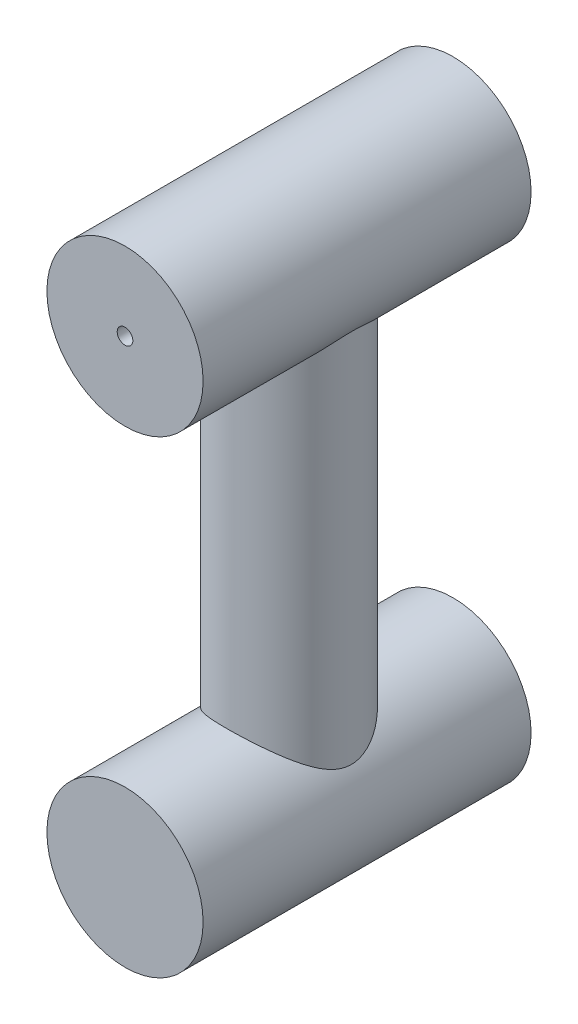
ISO-10303-21;
HEADER;
FILE_DESCRIPTION(('STEP AP214'),'2;1');
FILE_NAME('part.step','',(''),(''),'','','');
FILE_SCHEMA(('AUTOMOTIVE_DESIGN { 1 0 10303 214 1 1 1 1 }'));
ENDSEC;
DATA;
#1=APPLICATION_CONTEXT('core data for automotive mechanical design processes');
#2=APPLICATION_PROTOCOL_DEFINITION('international standard','automotive_design',2000,#1);
#3=PRODUCT_CONTEXT('',#1,'mechanical');
#4=PRODUCT('Part','Part','',(#3));
#5=PRODUCT_RELATED_PRODUCT_CATEGORY('part','',(#4));
#6=PRODUCT_DEFINITION_FORMATION('','',#4);
#7=PRODUCT_DEFINITION_CONTEXT('part definition',#1,'design');
#8=PRODUCT_DEFINITION('design','',#6,#7);
#9=PRODUCT_DEFINITION_SHAPE('','',#8);
#10=(LENGTH_UNIT() NAMED_UNIT(*) SI_UNIT(.MILLI.,.METRE.));
#11=(NAMED_UNIT(*) PLANE_ANGLE_UNIT() SI_UNIT($,.RADIAN.));
#12=(NAMED_UNIT(*) SI_UNIT($,.STERADIAN.) SOLID_ANGLE_UNIT());
#13=UNCERTAINTY_MEASURE_WITH_UNIT(LENGTH_MEASURE(1.E-05),#10,'distance_accuracy_value','');
#14=(GEOMETRIC_REPRESENTATION_CONTEXT(3) GLOBAL_UNCERTAINTY_ASSIGNED_CONTEXT((#13)) GLOBAL_UNIT_ASSIGNED_CONTEXT((#10,
#11,#12)) REPRESENTATION_CONTEXT('',''));
#15=CARTESIAN_POINT('',(0.,0.,0.));
#16=DIRECTION('',(0.,0.,1.));
#17=DIRECTION('',(1.,0.,0.));
#18=AXIS2_PLACEMENT_3D('',#15,#16,#17);
#19=CARTESIAN_POINT('',(0.,150.,0.));
#20=DIRECTION('',(0.,-1.,0.));
#21=DIRECTION('',(0.,0.,-1.));
#22=AXIS2_PLACEMENT_3D('',#19,#20,#21);
#23=CYLINDRICAL_SURFACE('',#22,20.);
#24=CARTESIAN_POINT('',(0.,25.,-20.));
#25=CARTESIAN_POINT('',(0.480230989703531,24.9999961848675,-19.9999960873677));
#26=CARTESIAN_POINT('',(0.960535836305338,24.9861312304145,-19.9826723587445));
#27=CARTESIAN_POINT('',(1.91728683457106,24.9309814349292,-19.9136700404392));
#28=CARTESIAN_POINT('',(2.3937308090506,24.8896820830818,-19.8619732698869));
#29=CARTESIAN_POINT('',(3.33960791078649,24.7805185198449,-19.7250047398072));
#30=CARTESIAN_POINT('',(3.80902584649178,24.712603532766,-19.6396688036891));
#31=CARTESIAN_POINT('',(4.73639266175432,24.5517428296068,-19.4368692020349));
#32=CARTESIAN_POINT('',(5.19434281461134,24.4587999060374,-19.3194091207517));
#33=CARTESIAN_POINT('',(6.09302297940696,24.2504947079046,-19.0550013907087));
#34=CARTESIAN_POINT('',(6.53384455581926,24.135279959547,-18.9082475825725));
#35=CARTESIAN_POINT('',(7.39905284145709,23.8842407598241,-18.5867436845025));
#36=CARTESIAN_POINT('',(7.82343944789078,23.7484161795817,-18.4119934195011));
#37=CARTESIAN_POINT('',(8.65393451268829,23.4585340233295,-18.0365476676675));
#38=CARTESIAN_POINT('',(9.06004750544,23.3044810053207,-17.8358586656344));
#39=CARTESIAN_POINT('',(9.85291114261492,22.9805057097293,-17.4104176654588));
#40=CARTESIAN_POINT('',(10.239657802922,22.8105801872293,-17.185660745577));
#41=CARTESIAN_POINT('',(11.1240837702697,22.3957408802365,-16.631708753019));
#42=CARTESIAN_POINT('',(11.6134997974831,22.1453183968945,-16.2933984442422));
#43=CARTESIAN_POINT('',(12.5542891253821,21.6258819372534,-15.5800698126026));
#44=CARTESIAN_POINT('',(13.005650188539,21.3568620307175,-15.2050397647464));
#45=CARTESIAN_POINT('',(13.8707836996136,20.8054114271942,-14.4202417370912));
#46=CARTESIAN_POINT('',(14.2844532162996,20.5229470353298,-14.0103842111519));
#47=CARTESIAN_POINT('',(15.0724701469454,19.9513787857267,-13.1589192513533));
#48=CARTESIAN_POINT('',(15.4468220253881,19.6622756863602,-12.7173154318702));
#49=CARTESIAN_POINT('',(16.1614492543608,19.0793974271459,-11.7962985532676));
#50=CARTESIAN_POINT('',(16.5010997452855,18.7856199454358,-11.3164020038731));
#51=CARTESIAN_POINT('',(17.1388512744731,18.2056451793498,-10.3250788941917));
#52=CARTESIAN_POINT('',(17.4369391773761,17.9194503144112,-9.81364243941471));
#53=CARTESIAN_POINT('',(17.9891202491486,17.3650266544061,-8.76038016086283));
#54=CARTESIAN_POINT('',(18.2433325567539,17.0967504593018,-8.21864209510451));
#55=CARTESIAN_POINT('',(18.705911709388,16.5893497664292,-7.10302063922598));
#56=CARTESIAN_POINT('',(18.9143177227039,16.350200441349,-6.52916524318589));
#57=CARTESIAN_POINT('',(19.2031751366055,16.0082771872612,-5.60037075410327));
#58=CARTESIAN_POINT('',(19.3003699483551,15.8907318506006,-5.25601185870824));
#59=CARTESIAN_POINT('',(19.4771961806058,15.6734941834036,-4.55726308551195));
#60=CARTESIAN_POINT('',(19.5568303868741,15.573799021636,-4.20287480882394));
#61=CARTESIAN_POINT('',(19.6972552533926,15.3958112505024,-3.48586769498367));
#62=CARTESIAN_POINT('',(19.7580855656028,15.3174736460166,-3.12326793175904));
#63=CARTESIAN_POINT('',(19.8600201720531,15.1850786698748,-2.3908682437235));
#64=CARTESIAN_POINT('',(19.901124706637,15.1310210023862,-2.02106840669726));
#65=CARTESIAN_POINT('',(19.962971581675,15.0493339995019,-1.27344787413833));
#66=CARTESIAN_POINT('',(19.9835283203066,15.021945615624,-0.895585009326308));
#67=CARTESIAN_POINT('',(20.0031075411687,14.9958649721026,-0.13831657356457));
#68=CARTESIAN_POINT('',(20.002131085978,14.9971712964875,0.241088920338706));
#69=CARTESIAN_POINT('',(19.9786629633872,15.0284195746855,0.998309025602272));
#70=CARTESIAN_POINT('',(19.9561556870445,15.0583823031863,1.37612228306018));
#71=CARTESIAN_POINT('',(19.8901730043733,15.1454268921656,2.12674651807091));
#72=CARTESIAN_POINT('',(19.8466946666454,15.2025125439529,2.49955678880044));
#73=CARTESIAN_POINT('',(19.7313572667812,15.3519959503499,3.29537216756557));
#74=CARTESIAN_POINT('',(19.656123170792,15.4485199241233,3.71710930279068));
#75=CARTESIAN_POINT('',(19.4806804186697,15.6691696556899,4.54791367768941));
#76=CARTESIAN_POINT('',(19.3804663721062,15.7933013703414,4.95697816127987));
#77=CARTESIAN_POINT('',(19.156558761323,16.0641576278707,5.762056080849));
#78=CARTESIAN_POINT('',(19.0328077958795,16.210937235134,6.15803477313653));
#79=CARTESIAN_POINT('',(18.7635141789238,16.5218910140841,6.93540042100296));
#80=CARTESIAN_POINT('',(18.6179697853777,16.6860665759907,7.31678620705125));
#81=CARTESIAN_POINT('',(18.2297427509491,17.1112524260242,8.24874571504505));
#82=CARTESIAN_POINT('',(17.9744505911235,17.3802326509791,8.79045763071513));
#83=CARTESIAN_POINT('',(17.420755984275,17.9351938891373,9.84229180696013));
#84=CARTESIAN_POINT('',(17.122333612766,18.2211827235266,10.3523993110648));
#85=CARTESIAN_POINT('',(16.4835639709425,18.8010220720833,11.3419236297298));
#86=CARTESIAN_POINT('',(16.1431681112148,19.0948813834683,11.8213038798201));
#87=CARTESIAN_POINT('',(15.4215686510459,19.6822690166449,12.7483398529192));
#88=CARTESIAN_POINT('',(15.0403717610555,19.9757973848658,13.1960007726658));
#89=CARTESIAN_POINT('',(14.2267204789852,20.56353520931,14.0700505822943));
#90=CARTESIAN_POINT('',(13.7931665008075,20.8575522530836,14.4955483296281));
#91=CARTESIAN_POINT('',(12.88370321592,21.4312715917016,15.3095623417148));
#92=CARTESIAN_POINT('',(12.4077876821241,21.7109717724385,15.6980731520131));
#93=CARTESIAN_POINT('',(11.4153689615401,22.2487508185826,16.4337990435267));
#94=CARTESIAN_POINT('',(10.8989612105796,22.5068777273405,16.7811066493549));
#95=CARTESIAN_POINT('',(10.0947877798958,22.8731742166952,17.2682798593382));
#96=CARTESIAN_POINT('',(9.82183889485741,22.9917772413649,17.425022116157));
#97=CARTESIAN_POINT('',(9.26623527822425,23.2212666354261,17.7267264088392));
#98=CARTESIAN_POINT('',(8.98357823130772,23.332151144657,17.87168560639));
#99=CARTESIAN_POINT('',(8.28706523180419,23.5905697847685,18.2079924512593));
#100=CARTESIAN_POINT('',(7.86843138186448,23.7336902183121,18.3929235893383));
#101=CARTESIAN_POINT('',(7.01408763071896,24.0000570456058,18.7353759658125));
#102=CARTESIAN_POINT('',(6.57838200132552,24.1233083721521,18.8929040081973));
#103=CARTESIAN_POINT('',(5.69208561485838,24.3476687648972,19.1785501880921));
#104=CARTESIAN_POINT('',(5.24150238234391,24.4487888327059,19.3066829397495));
#105=CARTESIAN_POINT('',(4.32790269268517,24.6269331335526,19.53178364313));
#106=CARTESIAN_POINT('',(3.86488591273866,24.7039567403355,19.6287507848761));
#107=CARTESIAN_POINT('',(2.92716764551453,24.8325753779163,19.7903818084788));
#108=CARTESIAN_POINT('',(2.45241735536775,24.8840339375832,19.8548723484217));
#109=CARTESIAN_POINT('',(1.49734229662201,24.9597159082281,19.9496424544463));
#110=CARTESIAN_POINT('',(1.01701753733561,24.9839393646978,19.9799220776715));
#111=CARTESIAN_POINT('',(0.0549043345204943,25.0045691499641,20.0057126367381));
#112=CARTESIAN_POINT('',(-0.426883892252319,25.0009794148755,20.0012284923378));
#113=CARTESIAN_POINT('',(-1.38785496908958,24.9660769609783,19.9575843387199));
#114=CARTESIAN_POINT('',(-1.8670379511332,24.934765659935,19.9184261028409));
#115=CARTESIAN_POINT('',(-2.78015849643189,24.8488165268105,19.810720193198));
#116=CARTESIAN_POINT('',(-3.21461112564091,24.7962787328625,19.7448164682203));
#117=CARTESIAN_POINT('',(-4.07513436349093,24.6694630558277,19.5853196961158));
#118=CARTESIAN_POINT('',(-4.50120551269393,24.5951865797115,19.4917284409766));
#119=CARTESIAN_POINT('',(-5.34259277816532,24.42623358784,19.2781004887208));
#120=CARTESIAN_POINT('',(-5.75790677120596,24.3315530786317,19.1580586146173));
#121=CARTESIAN_POINT('',(-6.57564496026684,24.12341056485,18.8930057816754));
#122=CARTESIAN_POINT('',(-6.97806844142222,24.0099475208046,18.7479934408916));
#123=CARTESIAN_POINT('',(-7.79276711501759,23.7584841992485,18.4248878921773));
#124=CARTESIAN_POINT('',(-8.20411611290138,23.6194013702753,18.2453048544663));
#125=CARTESIAN_POINT('',(-9.00889225247002,23.3243132570969,17.8616521346834));
#126=CARTESIAN_POINT('',(-9.40231886281722,23.1683074716468,17.6575817272956));
#127=CARTESIAN_POINT('',(-10.1701153552395,22.8416894726975,17.2267961362735));
#128=CARTESIAN_POINT('',(-10.5444883893908,22.6710796877776,17.0000847166964));
#129=CARTESIAN_POINT('',(-11.2735701785671,22.3175002002136,16.5256117016954));
#130=CARTESIAN_POINT('',(-11.6282759811351,22.1345286509113,16.2778469597967));
#131=CARTESIAN_POINT('',(-12.3827270021154,21.7229363307972,15.7140013916475));
#132=CARTESIAN_POINT('',(-12.7783040292519,21.4922264773285,15.3938621330051));
#133=CARTESIAN_POINT('',(-13.5405215254044,21.0203530896377,14.7278812003496));
#134=CARTESIAN_POINT('',(-13.9071586804601,20.7791883630926,14.3820365915465));
#135=CARTESIAN_POINT('',(-14.6122013533565,20.2896088485507,13.6651754843115));
#136=CARTESIAN_POINT('',(-14.9505268508652,20.0411760229962,13.2940926782727));
#137=CARTESIAN_POINT('',(-15.5976192298561,19.5417845920472,12.5285867148805));
#138=CARTESIAN_POINT('',(-15.9063841626685,19.2908258213427,12.1341620215698));
#139=CARTESIAN_POINT('',(-16.5567761209823,18.7374522199289,11.2357912606664));
#140=CARTESIAN_POINT('',(-16.8913536392883,18.4354859261251,10.7264360072061));
#141=CARTESIAN_POINT('',(-17.5155207405159,17.8435299837978,9.67373545045226));
#142=CARTESIAN_POINT('',(-17.8050864582713,17.5535467480784,9.13037232893952));
#143=CARTESIAN_POINT('',(-18.3358678585784,16.9983189540831,8.01113941161474));
#144=CARTESIAN_POINT('',(-18.5772503518305,16.7329908075117,7.43539093373043));
#145=CARTESIAN_POINT('',(-19.008964021819,16.2408850502207,6.24950918151507));
#146=CARTESIAN_POINT('',(-19.1993581696422,16.0140600158116,5.6394194570051));
#147=CARTESIAN_POINT('',(-19.4487995760101,15.7087030989653,4.67605613825766));
#148=CARTESIAN_POINT('',(-19.5279053451975,15.6100539569417,4.33425194951327));
#149=CARTESIAN_POINT('',(-19.6687547088484,15.4322049914862,3.64207807353175));
#150=CARTESIAN_POINT('',(-19.7305013213618,15.353001787502,3.29170988675247));
#151=CARTESIAN_POINT('',(-19.8354952496202,15.2171129521132,2.58467642413906));
#152=CARTESIAN_POINT('',(-19.8787832343268,15.1603778377851,2.22802681360336));
#153=CARTESIAN_POINT('',(-19.9461891908989,15.0715849069154,1.50982970202826));
#154=CARTESIAN_POINT('',(-19.970307290811,15.0395269255412,1.14828223372085));
#155=CARTESIAN_POINT('',(-19.9988963097935,15.0014910958757,0.421038396001951));
#156=CARTESIAN_POINT('',(-20.00325928095,14.9956565414837,0.0553301523515066));
#157=CARTESIAN_POINT('',(-19.9919373640192,15.010746863965,-0.675205405837988));
#158=CARTESIAN_POINT('',(-19.9762528240442,15.0316712761858,-1.04003273556334));
#159=CARTESIAN_POINT('',(-19.9251769640672,15.099307811783,-1.76637086354416));
#160=CARTESIAN_POINT('',(-19.8897586316735,15.1460552820251,-2.12787642384807));
#161=CARTESIAN_POINT('',(-19.7999666765461,15.2632476527416,-2.84461842112777));
#162=CARTESIAN_POINT('',(-19.745590124879,15.3336962148363,-3.19985388049516));
#163=CARTESIAN_POINT('',(-19.6014887547507,15.517692296957,-3.99854431614062));
#164=CARTESIAN_POINT('',(-19.5061601205305,15.6377605537574,-4.43948708980482));
#165=CARTESIAN_POINT('',(-19.2884919453343,15.9054632992559,-5.30602322130213));
#166=CARTESIAN_POINT('',(-19.1661435082343,16.0531068644995,-5.73161146992649));
#167=CARTESIAN_POINT('',(-18.8960714711118,16.3701531649741,-6.56748573501336));
#168=CARTESIAN_POINT('',(-18.7482873684788,16.539607532446,-6.97773235986948));
#169=CARTESIAN_POINT('',(-18.4291192260517,16.8945133462898,-7.78168629093866));
#170=CARTESIAN_POINT('',(-18.2577342560041,17.079965423121,-8.17539294441221));
#171=CARTESIAN_POINT('',(-17.8095827766314,17.5489655484806,-9.12160860423861));
#172=CARTESIAN_POINT('',(-17.5202929830492,17.8388318746095,-9.66508540470204));
#173=CARTESIAN_POINT('',(-16.8964436603964,18.4308281603071,-10.7184432121036));
#174=CARTESIAN_POINT('',(-16.5618657183709,18.732963072798,-11.2283104282466));
#175=CARTESIAN_POINT('',(-15.8482879271303,19.3404126764517,-12.2148536253121));
#176=CARTESIAN_POINT('',(-15.4692461046248,19.6457301201562,-12.6914975563328));
#177=CARTESIAN_POINT('',(-14.6676100989712,20.2512609716486,-13.6100213768864));
#178=CARTESIAN_POINT('',(-14.2450228000759,20.5514751775089,-14.0519067421009));
#179=CARTESIAN_POINT('',(-13.3507061056025,21.1435580554426,-14.9045400439836));
#180=CARTESIAN_POINT('',(-12.8784006852095,21.4352638367223,-15.3147988667469));
#181=CARTESIAN_POINT('',(-11.8898743997865,21.9989686225749,-16.0943168368688));
#182=CARTESIAN_POINT('',(-11.3736462703045,22.2709643534401,-16.4635691787238));
#183=CARTESIAN_POINT('',(-10.2999855725546,22.7873721078698,-17.1556765770374));
#184=CARTESIAN_POINT('',(-9.74265566265225,23.0318492432367,-17.478641671167));
#185=CARTESIAN_POINT('',(-8.58844668771732,23.4866490913199,-18.0737237537101));
#186=CARTESIAN_POINT('',(-7.99159213315966,23.6969926971429,-18.3458718626501));
#187=CARTESIAN_POINT('',(-6.96365142630765,24.0144793347202,-18.7538200416705));
#188=CARTESIAN_POINT('',(-6.54211563765548,24.1328869718868,-18.9051173274364));
#189=CARTESIAN_POINT('',(-5.68497622087226,24.3490501254052,-19.1802896508597));
#190=CARTESIAN_POINT('',(-5.24937364512001,24.4468071825816,-19.3041667344841));
#191=CARTESIAN_POINT('',(-4.36753016505049,24.6196290238545,-19.5225658352498));
#192=CARTESIAN_POINT('',(-3.92131554569164,24.6947446239837,-19.6171536019856));
#193=CARTESIAN_POINT('',(-3.02031822549153,24.8210480155094,-19.7759133096869));
#194=CARTESIAN_POINT('',(-2.5655394326392,24.8722464580861,-19.8400987900744));
#195=CARTESIAN_POINT('',(-1.75888736046638,24.9405137175445,-19.9256042118999));
#196=CARTESIAN_POINT('',(-1.40812900270433,24.9627918945395,-19.9534735152448));
#197=CARTESIAN_POINT('',(-0.704927264758647,24.9925380835892,-19.9906749075479));
#198=CARTESIAN_POINT('',(-0.352483527123381,25.0000028002595,-20.000002871823));
#199=CARTESIAN_POINT('',(0.,25.,-20.));
#200=B_SPLINE_CURVE_WITH_KNOTS('',3,(#24,#25,#26,#27,#28,#29,#30,#31,#32,#33,#34,#35,#36,#37,
#38,#39,#40,#41,#42,#43,#44,#45,#46,#47,#48,#49,#50,#51,#52,#53,#54,#55,#56,#57,#58,#59,#60,#61,
#62,#63,#64,#65,#66,#67,#68,#69,#70,#71,#72,#73,#74,#75,#76,#77,#78,#79,#80,#81,#82,#83,#84,#85,
#86,#87,#88,#89,#90,#91,#92,#93,#94,#95,#96,#97,#98,#99,#100,#101,#102,#103,#104,#105,#106,#107,
#108,#109,#110,#111,#112,#113,#114,#115,#116,#117,#118,#119,#120,#121,#122,#123,#124,#125,#126,
#127,#128,#129,#130,#131,#132,#133,#134,#135,#136,#137,#138,#139,#140,#141,#142,#143,#144,#145,
#146,#147,#148,#149,#150,#151,#152,#153,#154,#155,#156,#157,#158,#159,#160,#161,#162,#163,#164,
#165,#166,#167,#168,#169,#170,#171,#172,#173,#174,#175,#176,#177,#178,#179,#180,#181,#182,#183,
#184,#185,#186,#187,#188,#189,#190,#191,#192,#193,#194,#195,#196,#197,#198,#199),.UNSPECIFIED.,
.T.,.F.,(4,2,2,2,2,2,2,2,2,2,2,2,2,2,2,2,2,2,2,2,2,2,2,2,2,2,2,2,2,2,2,2,2,2,2,2,2,2,2,2,2,2,2,
2,2,2,2,2,2,2,2,2,2,2,2,2,2,2,2,2,2,2,2,2,2,2,2,2,2,2,2,2,2,2,2,2,2,2,2,2,2,2,2,2,2,2,2,4),(0.,
1.4403137930791,2.88139001537349,4.32522892398689,5.76890680188147,7.20333074629157,
8.63776366079905,10.0718386518902,11.5062074644402,13.4400199592029,15.3744519666943,
17.3140175594305,19.2533626775734,21.223053242228,23.1933648999037,25.1582392425343,
27.1214268566114,28.250500792503,29.3793954860789,30.5058931681581,31.6323771243511,
32.7689467217837,33.9054602340844,35.0427982959194,36.1802953844596,37.4956824296446,
38.8113535686643,40.130275457837,41.4493028299286,43.4158969357586,45.3834024530428,
47.3532073647767,49.3226888036402,51.3449316402351,53.3674722360229,55.3853814808751,
56.3940844689467,57.4030297185555,58.8400974705322,60.2768078981553,61.712802496146,
63.1488344118286,64.5924519116314,66.0360670001163,67.4794777923416,68.9228147684062,
70.24897947206,71.5750583626742,72.9013970279613,74.2278091206769,75.6361295515189,
77.0444917071215,78.4526201117595,79.8609593363193,81.5356358539052,83.2105038645389,
84.8899561993964,86.5695191697533,88.60752224703,90.646602210751,92.6784955245126,
94.7078677358487,95.800341801628,96.8926258130675,97.9824906574178,99.0723482218806,
100.168153962273,101.263940674954,102.361231041829,103.458691008786,104.857006416013,
106.255782899233,107.657933768014,109.060139919912,111.098801075017,113.138293599126,
115.179727108252,117.220838373904,119.288945022562,121.357394386303,123.420841870812,
125.483021517334,126.871460501995,128.259795852899,129.644991644136,131.029569967839,
132.08650714014,133.143679411056),.UNSPECIFIED.);
#201=CARTESIAN_POINT('',(0.,25.,-20.));
#202=VERTEX_POINT('',#201);
#203=EDGE_CURVE('E64',#202,#202,#200,.T.);
#204=ORIENTED_EDGE('',*,*,#203,.F.);
#205=EDGE_LOOP('',(#204));
#206=FACE_BOUND('',#205,.T.);
#207=CARTESIAN_POINT('',(0.,125.,-20.));
#208=CARTESIAN_POINT('',(-0.480230989703532,125.000003815133,-19.9999960873677));
#209=CARTESIAN_POINT('',(-0.960535836305339,125.013868769585,-19.9826723587445));
#210=CARTESIAN_POINT('',(-1.91728683457106,125.069018565071,-19.9136700404392));
#211=CARTESIAN_POINT('',(-2.39373080905061,125.110317916918,-19.8619732698869));
#212=CARTESIAN_POINT('',(-3.33960791078649,125.219481480155,-19.7250047398072));
#213=CARTESIAN_POINT('',(-3.80902584649178,125.287396467234,-19.6396688036891));
#214=CARTESIAN_POINT('',(-4.73639266175432,125.448257170393,-19.4368692020349));
#215=CARTESIAN_POINT('',(-5.19434281461134,125.541200093963,-19.3194091207517));
#216=CARTESIAN_POINT('',(-6.09302297940696,125.749505292095,-19.0550013907087));
#217=CARTESIAN_POINT('',(-6.53384455581925,125.864720040453,-18.9082475825725));
#218=CARTESIAN_POINT('',(-7.39905284145708,126.115759240176,-18.5867436845025));
#219=CARTESIAN_POINT('',(-7.82343944789077,126.251583820418,-18.4119934195011));
#220=CARTESIAN_POINT('',(-8.65393451268828,126.54146597667,-18.0365476676675));
#221=CARTESIAN_POINT('',(-9.06004750543999,126.695518994679,-17.8358586656344));
#222=CARTESIAN_POINT('',(-9.85291114261492,127.019494290271,-17.4104176654588));
#223=CARTESIAN_POINT('',(-10.239657802922,127.189419812771,-17.185660745577));
#224=CARTESIAN_POINT('',(-11.1240837702697,127.604259119764,-16.631708753019));
#225=CARTESIAN_POINT('',(-11.6134997974831,127.854681603106,-16.2933984442422));
#226=CARTESIAN_POINT('',(-12.5542891253821,128.374118062747,-15.5800698126026));
#227=CARTESIAN_POINT('',(-13.005650188539,128.643137969283,-15.2050397647464));
#228=CARTESIAN_POINT('',(-13.8707836996136,129.194588572806,-14.4202417370912));
#229=CARTESIAN_POINT('',(-14.2844532162996,129.47705296467,-14.0103842111519));
#230=CARTESIAN_POINT('',(-15.0724701469454,130.048621214273,-13.1589192513533));
#231=CARTESIAN_POINT('',(-15.4468220253881,130.33772431364,-12.7173154318702));
#232=CARTESIAN_POINT('',(-16.1614492543608,130.920602572854,-11.7962985532676));
#233=CARTESIAN_POINT('',(-16.5010997452855,131.214380054564,-11.3164020038731));
#234=CARTESIAN_POINT('',(-17.138851274473,131.79435482065,-10.3250788941917));
#235=CARTESIAN_POINT('',(-17.4369391773761,132.080549685589,-9.81364243941472));
#236=CARTESIAN_POINT('',(-17.9891202491486,132.634973345594,-8.76038016086284));
#237=CARTESIAN_POINT('',(-18.2433325567539,132.903249540698,-8.21864209510451));
#238=CARTESIAN_POINT('',(-18.705911709388,133.410650233571,-7.10302063922598));
#239=CARTESIAN_POINT('',(-18.9143177227039,133.649799558651,-6.5291652431859));
#240=CARTESIAN_POINT('',(-19.2031751366055,133.991722812739,-5.60037075410329));
#241=CARTESIAN_POINT('',(-19.3003699483551,134.109268149399,-5.25601185870825));
#242=CARTESIAN_POINT('',(-19.4771961806058,134.326505816596,-4.55726308551196));
#243=CARTESIAN_POINT('',(-19.5568303868741,134.426200978364,-4.20287480882395));
#244=CARTESIAN_POINT('',(-19.6972552533926,134.604188749498,-3.48586769498368));
#245=CARTESIAN_POINT('',(-19.7580855656028,134.682526353983,-3.12326793175906));
#246=CARTESIAN_POINT('',(-19.8600201720531,134.814921330125,-2.39086824372352));
#247=CARTESIAN_POINT('',(-19.901124706637,134.868978997614,-2.02106840669728));
#248=CARTESIAN_POINT('',(-19.962971581675,134.950666000498,-1.27344787413834));
#249=CARTESIAN_POINT('',(-19.9835283203066,134.978054384376,-0.895585009326319));
#250=CARTESIAN_POINT('',(-20.0031075411687,135.004135027897,-0.138316573564579));
#251=CARTESIAN_POINT('',(-20.002131085978,135.002828703512,0.241088920338697));
#252=CARTESIAN_POINT('',(-19.9786629633872,134.971580425314,0.998309025602263));
#253=CARTESIAN_POINT('',(-19.9561556870445,134.941617696814,1.37612228306017));
#254=CARTESIAN_POINT('',(-19.8901730043733,134.854573107834,2.1267465180709));
#255=CARTESIAN_POINT('',(-19.8466946666454,134.797487456047,2.49955678880043));
#256=CARTESIAN_POINT('',(-19.7313572667812,134.64800404965,3.29537216756556));
#257=CARTESIAN_POINT('',(-19.656123170792,134.551480075877,3.71710930279067));
#258=CARTESIAN_POINT('',(-19.4806804186697,134.33083034431,4.5479136776894));
#259=CARTESIAN_POINT('',(-19.3804663721062,134.206698629659,4.95697816127985));
#260=CARTESIAN_POINT('',(-19.156558761323,133.935842372129,5.76205608084899));
#261=CARTESIAN_POINT('',(-19.0328077958795,133.789062764866,6.15803477313651));
#262=CARTESIAN_POINT('',(-18.7635141789238,133.478108985916,6.93540042100294));
#263=CARTESIAN_POINT('',(-18.6179697853777,133.313933424009,7.31678620705124));
#264=CARTESIAN_POINT('',(-18.2297427509491,132.888747573976,8.24874571504504));
#265=CARTESIAN_POINT('',(-17.9744505911235,132.619767349021,8.79045763071512));
#266=CARTESIAN_POINT('',(-17.420755984275,132.064806110863,9.84229180696012));
#267=CARTESIAN_POINT('',(-17.122333612766,131.778817276473,10.3523993110647));
#268=CARTESIAN_POINT('',(-16.4835639709426,131.198977927917,11.3419236297298));
#269=CARTESIAN_POINT('',(-16.1431681112148,130.905118616532,11.8213038798201));
#270=CARTESIAN_POINT('',(-15.4215686510459,130.317730983355,12.7483398529192));
#271=CARTESIAN_POINT('',(-15.0403717610555,130.024202615134,13.1960007726658));
#272=CARTESIAN_POINT('',(-14.2267204789852,129.43646479069,14.0700505822943));
#273=CARTESIAN_POINT('',(-13.7931665008075,129.142447746916,14.4955483296281));
#274=CARTESIAN_POINT('',(-12.8837032159201,128.568728408298,15.3095623417147));
#275=CARTESIAN_POINT('',(-12.4077876821242,128.289028227561,15.6980731520131));
#276=CARTESIAN_POINT('',(-11.4153689615401,127.751249181417,16.4337990435267));
#277=CARTESIAN_POINT('',(-10.8989612105796,127.493122272659,16.7811066493549));
#278=CARTESIAN_POINT('',(-10.0947877798958,127.126825783305,17.2682798593382));
#279=CARTESIAN_POINT('',(-9.82183889485744,127.008222758635,17.425022116157));
#280=CARTESIAN_POINT('',(-9.26623527822428,126.778733364574,17.7267264088392));
#281=CARTESIAN_POINT('',(-8.98357823130775,126.667848855343,17.87168560639));
#282=CARTESIAN_POINT('',(-8.28706523180422,126.409430215232,18.2079924512593));
#283=CARTESIAN_POINT('',(-7.8684313818645,126.266309781688,18.3929235893383));
#284=CARTESIAN_POINT('',(-7.01408763071899,125.999942954394,18.7353759658125));
#285=CARTESIAN_POINT('',(-6.57838200132555,125.876691627848,18.8929040081973));
#286=CARTESIAN_POINT('',(-5.69208561485841,125.652331235103,19.1785501880921));
#287=CARTESIAN_POINT('',(-5.24150238234394,125.551211167294,19.3066829397495));
#288=CARTESIAN_POINT('',(-4.3279026926852,125.373066866447,19.53178364313));
#289=CARTESIAN_POINT('',(-3.86488591273869,125.296043259665,19.628750784876));
#290=CARTESIAN_POINT('',(-2.92716764551456,125.167424622084,19.7903818084787));
#291=CARTESIAN_POINT('',(-2.45241735536777,125.115966062417,19.8548723484217));
#292=CARTESIAN_POINT('',(-1.49734229662204,125.040284091772,19.9496424544463));
#293=CARTESIAN_POINT('',(-1.01701753733564,125.016060635302,19.9799220776715));
#294=CARTESIAN_POINT('',(-0.0549043345205205,124.995430850036,20.0057126367381));
#295=CARTESIAN_POINT('',(0.426883892252292,124.999020585124,20.0012284923378));
#296=CARTESIAN_POINT('',(1.38785496908955,125.033923039022,19.9575843387199));
#297=CARTESIAN_POINT('',(1.86703795113318,125.065234340065,19.9184261028409));
#298=CARTESIAN_POINT('',(2.78015849643187,125.15118347319,19.810720193198));
#299=CARTESIAN_POINT('',(3.2146111256409,125.203721267137,19.7448164682203));
#300=CARTESIAN_POINT('',(4.07513436349092,125.330536944172,19.5853196961158));
#301=CARTESIAN_POINT('',(4.50120551269392,125.404813420288,19.4917284409766));
#302=CARTESIAN_POINT('',(5.34259277816531,125.57376641216,19.2781004887208));
#303=CARTESIAN_POINT('',(5.75790677120595,125.668446921368,19.1580586146173));
#304=CARTESIAN_POINT('',(6.57564496026683,125.87658943515,18.8930057816754));
#305=CARTESIAN_POINT('',(6.97806844142221,125.990052479195,18.7479934408916));
#306=CARTESIAN_POINT('',(7.79276711501758,126.241515800752,18.4248878921774));
#307=CARTESIAN_POINT('',(8.20411611290137,126.380598629725,18.2453048544663));
#308=CARTESIAN_POINT('',(9.00889225247001,126.675686742903,17.8616521346834));
#309=CARTESIAN_POINT('',(9.40231886281721,126.831692528353,17.6575817272956));
#310=CARTESIAN_POINT('',(10.1701153552394,127.158310527302,17.2267961362735));
#311=CARTESIAN_POINT('',(10.5444883893908,127.328920312222,17.0000847166964));
#312=CARTESIAN_POINT('',(11.273570178567,127.682499799786,16.5256117016954));
#313=CARTESIAN_POINT('',(11.6282759811351,127.865471349089,16.2778469597967));
#314=CARTESIAN_POINT('',(12.3827270021154,128.277063669203,15.7140013916475));
#315=CARTESIAN_POINT('',(12.7783040292519,128.507773522672,15.3938621330051));
#316=CARTESIAN_POINT('',(13.5405215254044,128.979646910362,14.7278812003496));
#317=CARTESIAN_POINT('',(13.9071586804601,129.220811636907,14.3820365915465));
#318=CARTESIAN_POINT('',(14.6122013533565,129.710391151449,13.6651754843115));
#319=CARTESIAN_POINT('',(14.9505268508652,129.958823977004,13.2940926782727));
#320=CARTESIAN_POINT('',(15.5976192298561,130.458215407953,12.5285867148805));
#321=CARTESIAN_POINT('',(15.9063841626685,130.709174178657,12.1341620215699));
#322=CARTESIAN_POINT('',(16.5567761209823,131.262547780071,11.2357912606664));
#323=CARTESIAN_POINT('',(16.8913536392883,131.564514073875,10.7264360072061));
#324=CARTESIAN_POINT('',(17.5155207405159,132.156470016202,9.67373545045227));
#325=CARTESIAN_POINT('',(17.8050864582713,132.446453251922,9.13037232893954));
#326=CARTESIAN_POINT('',(18.3358678585784,133.001681045917,8.01113941161475));
#327=CARTESIAN_POINT('',(18.5772503518305,133.267009192488,7.43539093373044));
#328=CARTESIAN_POINT('',(19.008964021819,133.759114949779,6.24950918151509));
#329=CARTESIAN_POINT('',(19.1993581696422,133.985939984188,5.63941945700512));
#330=CARTESIAN_POINT('',(19.4487995760101,134.291296901035,4.67605613825768));
#331=CARTESIAN_POINT('',(19.5279053451975,134.389946043058,4.33425194951329));
#332=CARTESIAN_POINT('',(19.6687547088484,134.567795008514,3.64207807353177));
#333=CARTESIAN_POINT('',(19.7305013213618,134.646998212498,3.29170988675249));
#334=CARTESIAN_POINT('',(19.8354952496202,134.782887047887,2.58467642413908));
#335=CARTESIAN_POINT('',(19.8787832343268,134.839622162215,2.22802681360339));
#336=CARTESIAN_POINT('',(19.9461891908989,134.928415093085,1.50982970202829));
#337=CARTESIAN_POINT('',(19.970307290811,134.960473074459,1.14828223372087));
#338=CARTESIAN_POINT('',(19.9988963097935,134.998508904124,0.421038396001975));
#339=CARTESIAN_POINT('',(20.00325928095,135.004343458516,0.0553301523515299));
#340=CARTESIAN_POINT('',(19.9919373640192,134.989253136035,-0.675205405837969));
#341=CARTESIAN_POINT('',(19.9762528240442,134.968328723814,-1.04003273556332));
#342=CARTESIAN_POINT('',(19.9251769640672,134.900692188217,-1.76637086354416));
#343=CARTESIAN_POINT('',(19.8897586316735,134.853944717975,-2.12787642384806));
#344=CARTESIAN_POINT('',(19.7999666765461,134.736752347258,-2.84461842112776));
#345=CARTESIAN_POINT('',(19.745590124879,134.666303785164,-3.19985388049515));
#346=CARTESIAN_POINT('',(19.6014887547507,134.482307703043,-3.99854431614061));
#347=CARTESIAN_POINT('',(19.5061601205305,134.362239446243,-4.43948708980481));
#348=CARTESIAN_POINT('',(19.2884919453343,134.094536700744,-5.30602322130213));
#349=CARTESIAN_POINT('',(19.1661435082343,133.946893135501,-5.73161146992648));
#350=CARTESIAN_POINT('',(18.8960714711118,133.629846835026,-6.56748573501336));
#351=CARTESIAN_POINT('',(18.7482873684788,133.460392467554,-6.97773235986948));
#352=CARTESIAN_POINT('',(18.4291192260517,133.10548665371,-7.78168629093866));
#353=CARTESIAN_POINT('',(18.2577342560041,132.920034576879,-8.17539294441221));
#354=CARTESIAN_POINT('',(17.8095827766314,132.451034451519,-9.1216086042386));
#355=CARTESIAN_POINT('',(17.5202929830492,132.16116812539,-9.66508540470204));
#356=CARTESIAN_POINT('',(16.8964436603964,131.569171839693,-10.7184432121036));
#357=CARTESIAN_POINT('',(16.5618657183709,131.267036927202,-11.2283104282466));
#358=CARTESIAN_POINT('',(15.8482879271303,130.659587323548,-12.2148536253121));
#359=CARTESIAN_POINT('',(15.4692461046248,130.354269879844,-12.6914975563328));
#360=CARTESIAN_POINT('',(14.6676100989712,129.748739028351,-13.6100213768864));
#361=CARTESIAN_POINT('',(14.2450228000759,129.448524822491,-14.0519067421009));
#362=CARTESIAN_POINT('',(13.3507061056025,128.856441944557,-14.9045400439836));
#363=CARTESIAN_POINT('',(12.8784006852095,128.564736163278,-15.3147988667469));
#364=CARTESIAN_POINT('',(11.8898743997865,128.001031377425,-16.0943168368687));
#365=CARTESIAN_POINT('',(11.3736462703045,127.72903564656,-16.4635691787238));
#366=CARTESIAN_POINT('',(10.2999855725546,127.21262789213,-17.1556765770374));
#367=CARTESIAN_POINT('',(9.74265566265226,126.968150756763,-17.478641671167));
#368=CARTESIAN_POINT('',(8.58844668771733,126.51335090868,-18.0737237537101));
#369=CARTESIAN_POINT('',(7.99159213315967,126.303007302857,-18.3458718626501));
#370=CARTESIAN_POINT('',(6.96365142630765,125.98552066528,-18.7538200416705));
#371=CARTESIAN_POINT('',(6.54211563765548,125.867113028113,-18.9051173274364));
#372=CARTESIAN_POINT('',(5.68497622087226,125.650949874595,-19.1802896508597));
#373=CARTESIAN_POINT('',(5.24937364512001,125.553192817418,-19.3041667344841));
#374=CARTESIAN_POINT('',(4.36753016505049,125.380370976146,-19.5225658352498));
#375=CARTESIAN_POINT('',(3.92131554569164,125.305255376016,-19.6171536019856));
#376=CARTESIAN_POINT('',(3.02031822549153,125.178951984491,-19.7759133096869));
#377=CARTESIAN_POINT('',(2.56553943263921,125.127753541914,-19.8400987900744));
#378=CARTESIAN_POINT('',(1.75888736046638,125.059486282455,-19.9256042118999));
#379=CARTESIAN_POINT('',(1.40812900270433,125.03720810546,-19.9534735152448));
#380=CARTESIAN_POINT('',(0.704927264758649,125.007461916411,-19.9906749075479));
#381=CARTESIAN_POINT('',(0.352483527123382,124.999997199741,-20.000002871823));
#382=CARTESIAN_POINT('',(0.,125.,-20.));
#383=B_SPLINE_CURVE_WITH_KNOTS('',3,(#207,#208,#209,#210,#211,#212,#213,#214,#215,#216,#217,
#218,#219,#220,#221,#222,#223,#224,#225,#226,#227,#228,#229,#230,#231,#232,#233,#234,#235,#236,
#237,#238,#239,#240,#241,#242,#243,#244,#245,#246,#247,#248,#249,#250,#251,#252,#253,#254,#255,
#256,#257,#258,#259,#260,#261,#262,#263,#264,#265,#266,#267,#268,#269,#270,#271,#272,#273,#274,
#275,#276,#277,#278,#279,#280,#281,#282,#283,#284,#285,#286,#287,#288,#289,#290,#291,#292,#293,
#294,#295,#296,#297,#298,#299,#300,#301,#302,#303,#304,#305,#306,#307,#308,#309,#310,#311,#312,
#313,#314,#315,#316,#317,#318,#319,#320,#321,#322,#323,#324,#325,#326,#327,#328,#329,#330,#331,
#332,#333,#334,#335,#336,#337,#338,#339,#340,#341,#342,#343,#344,#345,#346,#347,#348,#349,#350,
#351,#352,#353,#354,#355,#356,#357,#358,#359,#360,#361,#362,#363,#364,#365,#366,#367,#368,#369,
#370,#371,#372,#373,#374,#375,#376,#377,#378,#379,#380,#381,#382),.UNSPECIFIED.,.T.,.F.,(4,2,2,
2,2,2,2,2,2,2,2,2,2,2,2,2,2,2,2,2,2,2,2,2,2,2,2,2,2,2,2,2,2,2,2,2,2,2,2,2,2,2,2,2,2,2,2,2,2,2,2,
2,2,2,2,2,2,2,2,2,2,2,2,2,2,2,2,2,2,2,2,2,2,2,2,2,2,2,2,2,2,2,2,2,2,2,2,4),(0.,1.44031379307911,
2.8813900153735,4.32522892398689,5.76890680188147,7.20333074629157,8.63776366079904,
10.0718386518902,11.5062074644402,13.4400199592029,15.3744519666943,17.3140175594305,
19.2533626775734,21.2230532422279,23.1933648999037,25.1582392425343,27.1214268566114,
28.250500792503,29.3793954860789,30.5058931681581,31.6323771243511,32.7689467217837,
33.9054602340844,35.0427982959194,36.1802953844596,37.4956824296446,38.8113535686643,
40.130275457837,41.4493028299286,43.4158969357586,45.3834024530428,47.3532073647767,
49.3226888036402,51.3449316402351,53.3674722360228,55.3853814808751,56.3940844689466,
57.4030297185554,58.8400974705322,60.2768078981553,61.712802496146,63.1488344118286,
64.5924519116314,66.0360670001163,67.4794777923416,68.9228147684062,70.24897947206,
71.5750583626742,72.9013970279613,74.2278091206769,75.6361295515189,77.0444917071215,
78.4526201117595,79.8609593363193,81.5356358539052,83.210503864539,84.8899561993964,
86.5695191697533,88.60752224703,90.646602210751,92.6784955245126,94.7078677358487,
95.800341801628,96.8926258130675,97.9824906574178,99.0723482218807,100.168153962273,
101.263940674954,102.361231041829,103.458691008786,104.857006416013,106.255782899233,
107.657933768014,109.060139919912,111.098801075017,113.138293599127,115.179727108252,
117.220838373904,119.288945022562,121.357394386303,123.420841870812,125.483021517334,
126.871460501995,128.259795852899,129.644991644136,131.029569967839,132.08650714014,
133.143679411056),.UNSPECIFIED.);
#384=CARTESIAN_POINT('',(0.,125.,-20.));
#385=VERTEX_POINT('',#384);
#386=EDGE_CURVE('E10',#385,#385,#383,.T.);
#387=ORIENTED_EDGE('',*,*,#386,.F.);
#388=EDGE_LOOP('',(#387));
#389=FACE_BOUND('',#388,.T.);
#390=ADVANCED_FACE('F37',(#206,#389),#23,.T.);
#391=CARTESIAN_POINT('',(0.,0.,-52.5));
#392=DIRECTION('',(0.,0.,1.));
#393=DIRECTION('',(1.,0.,0.));
#394=AXIS2_PLACEMENT_3D('',#391,#392,#393);
#395=CYLINDRICAL_SURFACE('',#394,25.);
#396=CARTESIAN_POINT('',(0.,0.,52.5));
#397=DIRECTION('',(0.,0.,1.));
#398=DIRECTION('',(1.,0.,0.));
#399=AXIS2_PLACEMENT_3D('',#396,#397,#398);
#400=CIRCLE('',#399,25.);
#401=CARTESIAN_POINT('',(25.,0.,52.5));
#402=VERTEX_POINT('',#401);
#403=EDGE_CURVE('E54',#402,#402,#400,.T.);
#404=ORIENTED_EDGE('',*,*,#403,.F.);
#405=EDGE_LOOP('',(#404));
#406=FACE_BOUND('',#405,.T.);
#407=CARTESIAN_POINT('',(0.,0.,-52.5));
#408=DIRECTION('',(0.,0.,1.));
#409=DIRECTION('',(1.,0.,0.));
#410=AXIS2_PLACEMENT_3D('',#407,#408,#409);
#411=CIRCLE('',#410,25.);
#412=CARTESIAN_POINT('',(25.,0.,-52.5));
#413=VERTEX_POINT('',#412);
#414=EDGE_CURVE('E50',#413,#413,#411,.T.);
#415=ORIENTED_EDGE('',*,*,#414,.T.);
#416=EDGE_LOOP('',(#415));
#417=FACE_BOUND('',#416,.T.);
#418=ORIENTED_EDGE('',*,*,#203,.T.);
#419=EDGE_LOOP('',(#418));
#420=FACE_BOUND('',#419,.T.);
#421=ADVANCED_FACE('F39',(#406,#417,#420),#395,.T.);
#422=CARTESIAN_POINT('',(0.,0.,-52.5));
#423=DIRECTION('',(0.,0.,1.));
#424=DIRECTION('',(1.,0.,0.));
#425=AXIS2_PLACEMENT_3D('',#422,#423,#424);
#426=PLANE('',#425);
#427=CARTESIAN_POINT('',(0.,0.,-52.5));
#428=DIRECTION('',(0.,0.,-1.));
#429=DIRECTION('',(-1.,0.,0.));
#430=AXIS2_PLACEMENT_3D('',#427,#428,#429);
#431=CIRCLE('',#430,2.5);
#432=CARTESIAN_POINT('',(-2.5,0.,-52.5));
#433=VERTEX_POINT('',#432);
#434=EDGE_CURVE('E62',#433,#433,#431,.T.);
#435=ORIENTED_EDGE('',*,*,#434,.F.);
#436=EDGE_LOOP('',(#435));
#437=FACE_BOUND('',#436,.T.);
#438=ORIENTED_EDGE('',*,*,#414,.F.);
#439=EDGE_LOOP('',(#438));
#440=FACE_BOUND('',#439,.T.);
#441=ADVANCED_FACE('F87',(#437,#440),#426,.F.);
#442=CARTESIAN_POINT('',(0.,0.,52.5));
#443=DIRECTION('',(0.,0.,1.));
#444=DIRECTION('',(1.,0.,0.));
#445=AXIS2_PLACEMENT_3D('',#442,#443,#444);
#446=PLANE('',#445);
#447=ORIENTED_EDGE('',*,*,#403,.T.);
#448=EDGE_LOOP('',(#447));
#449=FACE_BOUND('',#448,.T.);
#450=ADVANCED_FACE('F85',(#449),#446,.T.);
#451=CARTESIAN_POINT('',(0.,0.,-42.5));
#452=DIRECTION('',(0.,0.,-1.));
#453=DIRECTION('',(-1.,0.,0.));
#454=AXIS2_PLACEMENT_3D('',#451,#452,#453);
#455=CYLINDRICAL_SURFACE('',#454,2.5);
#456=CARTESIAN_POINT('',(0.,0.,-42.5));
#457=DIRECTION('',(0.,0.,-1.));
#458=DIRECTION('',(-1.,0.,0.));
#459=AXIS2_PLACEMENT_3D('',#456,#457,#458);
#460=CIRCLE('',#459,2.5);
#461=CARTESIAN_POINT('',(-2.5,0.,-42.5));
#462=VERTEX_POINT('',#461);
#463=EDGE_CURVE('E59',#462,#462,#460,.T.);
#464=ORIENTED_EDGE('',*,*,#463,.F.);
#465=EDGE_LOOP('',(#464));
#466=FACE_BOUND('',#465,.T.);
#467=ORIENTED_EDGE('',*,*,#434,.T.);
#468=EDGE_LOOP('',(#467));
#469=FACE_BOUND('',#468,.T.);
#470=ADVANCED_FACE('F81',(#466,#469),#455,.F.);
#471=CARTESIAN_POINT('',(0.,0.,-42.5));
#472=DIRECTION('',(0.,0.,-1.));
#473=DIRECTION('',(-1.,0.,0.));
#474=AXIS2_PLACEMENT_3D('',#471,#472,#473);
#475=PLANE('',#474);
#476=ORIENTED_EDGE('',*,*,#463,.T.);
#477=EDGE_LOOP('',(#476));
#478=FACE_BOUND('',#477,.T.);
#479=ADVANCED_FACE('F77',(#478),#475,.T.);
#480=CARTESIAN_POINT('',(0.,150.,-52.5));
#481=DIRECTION('',(0.,0.,1.));
#482=DIRECTION('',(1.,0.,0.));
#483=AXIS2_PLACEMENT_3D('',#480,#481,#482);
#484=CYLINDRICAL_SURFACE('',#483,25.);
#485=CARTESIAN_POINT('',(0.,150.,52.5));
#486=DIRECTION('',(0.,0.,-1.));
#487=DIRECTION('',(1.,0.,0.));
#488=AXIS2_PLACEMENT_3D('',#485,#486,#487);
#489=CIRCLE('',#488,25.);
#490=CARTESIAN_POINT('',(25.,150.,52.5));
#491=VERTEX_POINT('',#490);
#492=EDGE_CURVE('E176',#491,#491,#489,.T.);
#493=ORIENTED_EDGE('',*,*,#492,.T.);
#494=EDGE_LOOP('',(#493));
#495=FACE_BOUND('',#494,.T.);
#496=CARTESIAN_POINT('',(0.,150.,-52.5));
#497=DIRECTION('',(0.,0.,-1.));
#498=DIRECTION('',(1.,0.,0.));
#499=AXIS2_PLACEMENT_3D('',#496,#497,#498);
#500=CIRCLE('',#499,25.);
#501=CARTESIAN_POINT('',(25.,150.,-52.5));
#502=VERTEX_POINT('',#501);
#503=EDGE_CURVE('E69',#502,#502,#500,.T.);
#504=ORIENTED_EDGE('',*,*,#503,.F.);
#505=EDGE_LOOP('',(#504));
#506=FACE_BOUND('',#505,.T.);
#507=ORIENTED_EDGE('',*,*,#386,.T.);
#508=EDGE_LOOP('',(#507));
#509=FACE_BOUND('',#508,.T.);
#510=ADVANCED_FACE('F74',(#495,#506,#509),#484,.T.);
#511=CARTESIAN_POINT('',(0.,150.,-52.5));
#512=DIRECTION('',(0.,0.,1.));
#513=DIRECTION('',(1.,0.,0.));
#514=AXIS2_PLACEMENT_3D('',#511,#512,#513);
#515=PLANE('',#514);
#516=CARTESIAN_POINT('',(0.,150.,-52.5));
#517=DIRECTION('',(0.,0.,1.));
#518=DIRECTION('',(-1.,0.,0.));
#519=AXIS2_PLACEMENT_3D('',#516,#517,#518);
#520=CIRCLE('',#519,2.5);
#521=CARTESIAN_POINT('',(-2.5,150.,-52.5));
#522=VERTEX_POINT('',#521);
#523=EDGE_CURVE('E166',#522,#522,#520,.T.);
#524=ORIENTED_EDGE('',*,*,#523,.T.);
#525=EDGE_LOOP('',(#524));
#526=FACE_BOUND('',#525,.T.);
#527=ORIENTED_EDGE('',*,*,#503,.T.);
#528=EDGE_LOOP('',(#527));
#529=FACE_BOUND('',#528,.T.);
#530=ADVANCED_FACE('F114',(#526,#529),#515,.F.);
#531=CARTESIAN_POINT('',(0.,150.,52.5));
#532=DIRECTION('',(0.,0.,1.));
#533=DIRECTION('',(1.,0.,0.));
#534=AXIS2_PLACEMENT_3D('',#531,#532,#533);
#535=PLANE('',#534);
#536=CARTESIAN_POINT('',(0.,150.,52.5));
#537=DIRECTION('',(0.,0.,1.));
#538=DIRECTION('',(1.,0.,0.));
#539=AXIS2_PLACEMENT_3D('',#536,#537,#538);
#540=CIRCLE('',#539,2.5);
#541=CARTESIAN_POINT('',(2.5,150.,52.5));
#542=VERTEX_POINT('',#541);
#543=EDGE_CURVE('E167',#542,#542,#540,.T.);
#544=ORIENTED_EDGE('',*,*,#543,.F.);
#545=EDGE_LOOP('',(#544));
#546=FACE_BOUND('',#545,.T.);
#547=ORIENTED_EDGE('',*,*,#492,.F.);
#548=EDGE_LOOP('',(#547));
#549=FACE_BOUND('',#548,.T.);
#550=ADVANCED_FACE('F121',(#546,#549),#535,.T.);
#551=CARTESIAN_POINT('',(0.,150.,-42.5));
#552=DIRECTION('',(0.,0.,-1.));
#553=DIRECTION('',(-1.,0.,0.));
#554=AXIS2_PLACEMENT_3D('',#551,#552,#553);
#555=CYLINDRICAL_SURFACE('',#554,2.5);
#556=CARTESIAN_POINT('',(0.,150.,-42.5));
#557=DIRECTION('',(0.,0.,1.));
#558=DIRECTION('',(-1.,0.,0.));
#559=AXIS2_PLACEMENT_3D('',#556,#557,#558);
#560=CIRCLE('',#559,2.5);
#561=CARTESIAN_POINT('',(-2.5,150.,-42.5));
#562=VERTEX_POINT('',#561);
#563=EDGE_CURVE('E170',#562,#562,#560,.T.);
#564=ORIENTED_EDGE('',*,*,#563,.T.);
#565=EDGE_LOOP('',(#564));
#566=FACE_BOUND('',#565,.T.);
#567=ORIENTED_EDGE('',*,*,#523,.F.);
#568=EDGE_LOOP('',(#567));
#569=FACE_BOUND('',#568,.T.);
#570=ADVANCED_FACE('F127',(#566,#569),#555,.F.);
#571=CARTESIAN_POINT('',(0.,150.,-42.5));
#572=DIRECTION('',(0.,0.,-1.));
#573=DIRECTION('',(-1.,0.,0.));
#574=AXIS2_PLACEMENT_3D('',#571,#572,#573);
#575=PLANE('',#574);
#576=ORIENTED_EDGE('',*,*,#563,.F.);
#577=EDGE_LOOP('',(#576));
#578=FACE_BOUND('',#577,.T.);
#579=ADVANCED_FACE('F131',(#578),#575,.T.);
#580=CARTESIAN_POINT('',(0.,150.,47.5));
#581=DIRECTION('',(0.,0.,1.));
#582=DIRECTION('',(1.,0.,0.));
#583=AXIS2_PLACEMENT_3D('',#580,#581,#582);
#584=CYLINDRICAL_SURFACE('',#583,2.5);
#585=CARTESIAN_POINT('',(0.,150.,47.5));
#586=DIRECTION('',(0.,0.,1.));
#587=DIRECTION('',(1.,0.,0.));
#588=AXIS2_PLACEMENT_3D('',#585,#586,#587);
#589=CIRCLE('',#588,2.5);
#590=CARTESIAN_POINT('',(2.5,150.,47.5));
#591=VERTEX_POINT('',#590);
#592=EDGE_CURVE('E165',#591,#591,#589,.T.);
#593=ORIENTED_EDGE('',*,*,#592,.F.);
#594=EDGE_LOOP('',(#593));
#595=FACE_BOUND('',#594,.T.);
#596=ORIENTED_EDGE('',*,*,#543,.T.);
#597=EDGE_LOOP('',(#596));
#598=FACE_BOUND('',#597,.T.);
#599=ADVANCED_FACE('F139',(#595,#598),#584,.F.);
#600=CARTESIAN_POINT('',(0.,150.,47.5));
#601=DIRECTION('',(0.,0.,1.));
#602=DIRECTION('',(1.,0.,0.));
#603=AXIS2_PLACEMENT_3D('',#600,#601,#602);
#604=PLANE('',#603);
#605=ORIENTED_EDGE('',*,*,#592,.T.);
#606=EDGE_LOOP('',(#605));
#607=FACE_BOUND('',#606,.T.);
#608=ADVANCED_FACE('F152',(#607),#604,.T.);
#609=CLOSED_SHELL('',(#390,#421,#441,#450,#470,#479,#510,#530,#550,#570,#579,#599,#608));
#610=MANIFOLD_SOLID_BREP('B2',#609);
#611=ADVANCED_BREP_SHAPE_REPRESENTATION('',(#18,#610),#14);
#612=SHAPE_DEFINITION_REPRESENTATION(#9,#611);
ENDSEC;
END-ISO-10303-21;
